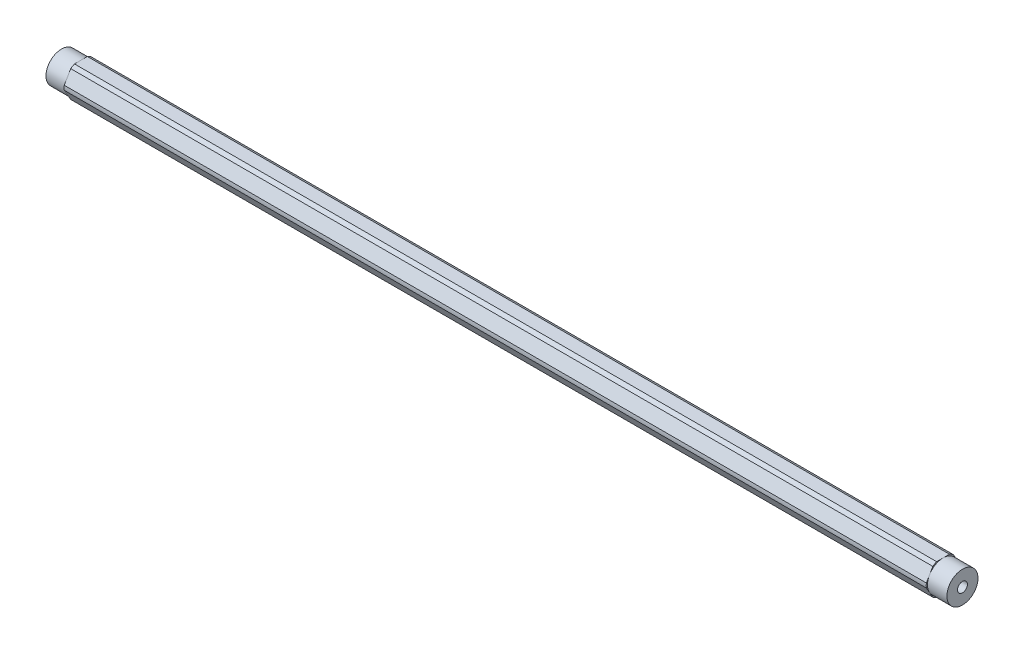
ISO-10303-21;
HEADER;
FILE_DESCRIPTION(('STEP AP214'),'2;1');
FILE_NAME('part.step','',(''),(''),'','','');
FILE_SCHEMA(('AUTOMOTIVE_DESIGN { 1 0 10303 214 1 1 1 1 }'));
ENDSEC;
DATA;
#1=APPLICATION_CONTEXT('core data for automotive mechanical design processes');
#2=APPLICATION_PROTOCOL_DEFINITION('international standard','automotive_design',2000,#1);
#3=PRODUCT_CONTEXT('',#1,'mechanical');
#4=PRODUCT('Part','Part','',(#3));
#5=PRODUCT_RELATED_PRODUCT_CATEGORY('part','',(#4));
#6=PRODUCT_DEFINITION_FORMATION('','',#4);
#7=PRODUCT_DEFINITION_CONTEXT('part definition',#1,'design');
#8=PRODUCT_DEFINITION('design','',#6,#7);
#9=PRODUCT_DEFINITION_SHAPE('','',#8);
#10=(LENGTH_UNIT() NAMED_UNIT(*) SI_UNIT(.MILLI.,.METRE.));
#11=(NAMED_UNIT(*) PLANE_ANGLE_UNIT() SI_UNIT($,.RADIAN.));
#12=(NAMED_UNIT(*) SI_UNIT($,.STERADIAN.) SOLID_ANGLE_UNIT());
#13=UNCERTAINTY_MEASURE_WITH_UNIT(LENGTH_MEASURE(1.E-05),#10,'distance_accuracy_value','');
#14=(GEOMETRIC_REPRESENTATION_CONTEXT(3) GLOBAL_UNCERTAINTY_ASSIGNED_CONTEXT((#13)) GLOBAL_UNIT_ASSIGNED_CONTEXT((#10,
#11,#12)) REPRESENTATION_CONTEXT('',''));
#15=CARTESIAN_POINT('',(0.,0.,0.));
#16=DIRECTION('',(0.,0.,1.));
#17=DIRECTION('',(1.,0.,0.));
#18=AXIS2_PLACEMENT_3D('',#15,#16,#17);
#19=CARTESIAN_POINT('',(-184.15,0.,0.));
#20=DIRECTION('',(1.,0.,0.));
#21=DIRECTION('',(0.,0.,-1.));
#22=AXIS2_PLACEMENT_3D('',#19,#20,#21);
#23=PLANE('',#22);
#24=CARTESIAN_POINT('',(-184.15,0.,0.));
#25=DIRECTION('',(1.,0.,0.));
#26=DIRECTION('',(0.,0.,-1.));
#27=AXIS2_PLACEMENT_3D('',#24,#25,#26);
#28=CIRCLE('',#27,2.0193);
#29=CARTESIAN_POINT('',(-184.15,0.,-2.0193));
#30=VERTEX_POINT('',#29);
#31=EDGE_CURVE('E253',#30,#30,#28,.T.);
#32=ORIENTED_EDGE('',*,*,#31,.T.);
#33=EDGE_LOOP('',(#32));
#34=FACE_BOUND('',#33,.T.);
#35=CARTESIAN_POINT('',(-184.15,0.,0.));
#36=DIRECTION('',(1.,0.,0.));
#37=DIRECTION('',(0.,0.,-1.));
#38=AXIS2_PLACEMENT_3D('',#35,#36,#37);
#39=CIRCLE('',#38,6.35);
#40=CARTESIAN_POINT('',(-184.15,0.,-6.35));
#41=VERTEX_POINT('',#40);
#42=EDGE_CURVE('E63',#41,#41,#39,.F.);
#43=ORIENTED_EDGE('',*,*,#42,.T.);
#44=EDGE_LOOP('',(#43));
#45=FACE_BOUND('',#44,.T.);
#46=ADVANCED_FACE('F55',(#34,#45),#23,.F.);
#47=CARTESIAN_POINT('',(184.15,3.175,-5.49926131403119));
#48=DIRECTION('',(0.,-0.5,0.866025403784439));
#49=DIRECTION('',(0.,-0.866025403784439,-0.5));
#50=AXIS2_PLACEMENT_3D('',#47,#48,#49);
#51=PLANE('',#50);
#52=DIRECTION('',(-1.,0.,0.));
#53=VECTOR('',#52,1.);
#54=CARTESIAN_POINT('',(184.15,0.893039571032186,-6.81675178197583));
#55=LINE('',#54,#53);
#56=CARTESIAN_POINT('',(176.2125,0.893039571032186,-6.81675178197583));
#57=VERTEX_POINT('',#56);
#58=CARTESIAN_POINT('',(-176.2125,0.893039571032186,-6.81675178197583));
#59=VERTEX_POINT('',#58);
#60=EDGE_CURVE('E212',#57,#59,#55,.T.);
#61=ORIENTED_EDGE('',*,*,#60,.T.);
#62=DIRECTION('',(0.,0.866025403784439,0.5));
#63=VECTOR('',#62,1.);
#64=CARTESIAN_POINT('',(-176.2125,3.175,-5.49926131403119));
#65=LINE('',#64,#63);
#66=CARTESIAN_POINT('',(-176.2125,3.175,-5.49926131403118));
#67=VERTEX_POINT('',#66);
#68=EDGE_CURVE('E70',#59,#67,#65,.T.);
#69=ORIENTED_EDGE('',*,*,#68,.T.);
#70=CARTESIAN_POINT('',(-176.2125,5.45696042896782,-4.18177084608654));
#71=VERTEX_POINT('',#70);
#72=EDGE_CURVE('E181',#67,#71,#65,.T.);
#73=ORIENTED_EDGE('',*,*,#72,.T.);
#74=DIRECTION('',(-1.,0.,0.));
#75=VECTOR('',#74,1.);
#76=CARTESIAN_POINT('',(184.15,5.45696042896782,-4.18177084608655));
#77=LINE('',#76,#75);
#78=CARTESIAN_POINT('',(176.2125,5.45696042896782,-4.18177084608654));
#79=VERTEX_POINT('',#78);
#80=EDGE_CURVE('E287',#79,#71,#77,.T.);
#81=ORIENTED_EDGE('',*,*,#80,.F.);
#82=DIRECTION('',(0.,0.866025403784439,0.5));
#83=VECTOR('',#82,1.);
#84=CARTESIAN_POINT('',(176.2125,3.175,-5.49926131403119));
#85=LINE('',#84,#83);
#86=CARTESIAN_POINT('',(176.2125,3.175,-5.49926131403118));
#87=VERTEX_POINT('',#86);
#88=EDGE_CURVE('E247',#87,#79,#85,.T.);
#89=ORIENTED_EDGE('',*,*,#88,.F.);
#90=EDGE_CURVE('E249',#57,#87,#85,.T.);
#91=ORIENTED_EDGE('',*,*,#90,.F.);
#92=EDGE_LOOP('',(#61,#69,#73,#81,#89,#91));
#93=FACE_BOUND('',#92,.T.);
#94=ADVANCED_FACE('F209',(#93),#51,.F.);
#95=CARTESIAN_POINT('',(184.15,0.,0.));
#96=DIRECTION('',(-1.,0.,0.));
#97=DIRECTION('',(0.,0.,1.));
#98=AXIS2_PLACEMENT_3D('',#95,#96,#97);
#99=CYLINDRICAL_SURFACE('',#98,6.874999966);
#100=ORIENTED_EDGE('',*,*,#80,.T.);
#101=CARTESIAN_POINT('',(-176.2125,0.,0.));
#102=DIRECTION('',(1.,0.,0.));
#103=DIRECTION('',(0.,0.,-1.));
#104=AXIS2_PLACEMENT_3D('',#101,#102,#103);
#105=CIRCLE('',#104,6.874999966);
#106=CARTESIAN_POINT('',(-176.2125,6.35,-2.63498093588929));
#107=VERTEX_POINT('',#106);
#108=EDGE_CURVE('E187',#71,#107,#105,.T.);
#109=ORIENTED_EDGE('',*,*,#108,.T.);
#110=DIRECTION('',(-1.,0.,0.));
#111=VECTOR('',#110,1.);
#112=CARTESIAN_POINT('',(184.15,6.35,-2.63498093588929));
#113=LINE('',#112,#111);
#114=CARTESIAN_POINT('',(176.2125,6.35,-2.63498093588929));
#115=VERTEX_POINT('',#114);
#116=EDGE_CURVE('E284',#115,#107,#113,.T.);
#117=ORIENTED_EDGE('',*,*,#116,.F.);
#118=CARTESIAN_POINT('',(176.2125,0.,0.));
#119=DIRECTION('',(1.,0.,0.));
#120=DIRECTION('',(0.,0.,-1.));
#121=AXIS2_PLACEMENT_3D('',#118,#119,#120);
#122=CIRCLE('',#121,6.874999966);
#123=EDGE_CURVE('E245',#79,#115,#122,.T.);
#124=ORIENTED_EDGE('',*,*,#123,.F.);
#125=EDGE_LOOP('',(#100,#109,#117,#124));
#126=FACE_BOUND('',#125,.T.);
#127=ADVANCED_FACE('F311',(#126),#99,.T.);
#128=CARTESIAN_POINT('',(184.15,6.35,0.));
#129=DIRECTION('',(0.,-1.,0.));
#130=DIRECTION('',(0.,0.,-1.));
#131=AXIS2_PLACEMENT_3D('',#128,#129,#130);
#132=PLANE('',#131);
#133=ORIENTED_EDGE('',*,*,#116,.T.);
#134=DIRECTION('',(0.,0.,1.));
#135=VECTOR('',#134,1.);
#136=CARTESIAN_POINT('',(-176.2125,6.35,0.));
#137=LINE('',#136,#135);
#138=CARTESIAN_POINT('',(-176.2125,6.35,0.));
#139=VERTEX_POINT('',#138);
#140=EDGE_CURVE('E350',#107,#139,#137,.T.);
#141=ORIENTED_EDGE('',*,*,#140,.T.);
#142=CARTESIAN_POINT('',(-176.2125,6.35,2.63498093588929));
#143=VERTEX_POINT('',#142);
#144=EDGE_CURVE('E353',#139,#143,#137,.T.);
#145=ORIENTED_EDGE('',*,*,#144,.T.);
#146=DIRECTION('',(-1.,0.,0.));
#147=VECTOR('',#146,1.);
#148=CARTESIAN_POINT('',(184.15,6.35,2.63498093588929));
#149=LINE('',#148,#147);
#150=CARTESIAN_POINT('',(176.2125,6.35,2.63498093588929));
#151=VERTEX_POINT('',#150);
#152=EDGE_CURVE('E281',#151,#143,#149,.T.);
#153=ORIENTED_EDGE('',*,*,#152,.F.);
#154=DIRECTION('',(0.,0.,1.));
#155=VECTOR('',#154,1.);
#156=CARTESIAN_POINT('',(176.2125,6.35,0.));
#157=LINE('',#156,#155);
#158=CARTESIAN_POINT('',(176.2125,6.35,0.));
#159=VERTEX_POINT('',#158);
#160=EDGE_CURVE('E242',#159,#151,#157,.T.);
#161=ORIENTED_EDGE('',*,*,#160,.F.);
#162=EDGE_CURVE('E244',#115,#159,#157,.T.);
#163=ORIENTED_EDGE('',*,*,#162,.F.);
#164=EDGE_LOOP('',(#133,#141,#145,#153,#161,#163));
#165=FACE_BOUND('',#164,.T.);
#166=ADVANCED_FACE('F318',(#165),#132,.F.);
#167=ORIENTED_EDGE('',*,*,#152,.T.);
#168=CARTESIAN_POINT('',(-176.2125,0.,0.));
#169=DIRECTION('',(1.,0.,0.));
#170=DIRECTION('',(0.,0.,-1.));
#171=AXIS2_PLACEMENT_3D('',#168,#169,#170);
#172=CIRCLE('',#171,6.874999966);
#173=CARTESIAN_POINT('',(-176.2125,5.45696042896782,4.18177084608654));
#174=VERTEX_POINT('',#173);
#175=EDGE_CURVE('E354',#143,#174,#172,.T.);
#176=ORIENTED_EDGE('',*,*,#175,.T.);
#177=DIRECTION('',(-1.,0.,0.));
#178=VECTOR('',#177,1.);
#179=CARTESIAN_POINT('',(184.15,5.45696042896782,4.18177084608654));
#180=LINE('',#179,#178);
#181=CARTESIAN_POINT('',(176.2125,5.45696042896782,4.18177084608654));
#182=VERTEX_POINT('',#181);
#183=EDGE_CURVE('E278',#182,#174,#180,.T.);
#184=ORIENTED_EDGE('',*,*,#183,.F.);
#185=CARTESIAN_POINT('',(176.2125,0.,0.));
#186=DIRECTION('',(1.,0.,0.));
#187=DIRECTION('',(0.,0.,-1.));
#188=AXIS2_PLACEMENT_3D('',#185,#186,#187);
#189=CIRCLE('',#188,6.874999966);
#190=EDGE_CURVE('E240',#151,#182,#189,.T.);
#191=ORIENTED_EDGE('',*,*,#190,.F.);
#192=EDGE_LOOP('',(#167,#176,#184,#191));
#193=FACE_BOUND('',#192,.T.);
#194=ADVANCED_FACE('F320',(#193),#99,.T.);
#195=CARTESIAN_POINT('',(184.15,3.175,5.49926131403119));
#196=DIRECTION('',(0.,-0.5,-0.866025403784439));
#197=DIRECTION('',(0.,0.866025403784439,-0.5));
#198=AXIS2_PLACEMENT_3D('',#195,#196,#197);
#199=PLANE('',#198);
#200=ORIENTED_EDGE('',*,*,#183,.T.);
#201=DIRECTION('',(0.,-0.866025403784439,0.5));
#202=VECTOR('',#201,1.);
#203=CARTESIAN_POINT('',(-176.2125,3.175,5.49926131403119));
#204=LINE('',#203,#202);
#205=CARTESIAN_POINT('',(-176.2125,3.175,5.49926131403119));
#206=VERTEX_POINT('',#205);
#207=EDGE_CURVE('E358',#174,#206,#204,.T.);
#208=ORIENTED_EDGE('',*,*,#207,.T.);
#209=CARTESIAN_POINT('',(-176.2125,0.893039571032176,6.81675178197583));
#210=VERTEX_POINT('',#209);
#211=EDGE_CURVE('E359',#206,#210,#204,.T.);
#212=ORIENTED_EDGE('',*,*,#211,.T.);
#213=DIRECTION('',(-1.,0.,0.));
#214=VECTOR('',#213,1.);
#215=CARTESIAN_POINT('',(184.15,0.893039571032176,6.81675178197583));
#216=LINE('',#215,#214);
#217=CARTESIAN_POINT('',(176.2125,0.893039571032176,6.81675178197583));
#218=VERTEX_POINT('',#217);
#219=EDGE_CURVE('E275',#218,#210,#216,.T.);
#220=ORIENTED_EDGE('',*,*,#219,.F.);
#221=DIRECTION('',(0.,-0.866025403784439,0.5));
#222=VECTOR('',#221,1.);
#223=CARTESIAN_POINT('',(176.2125,3.175,5.49926131403119));
#224=LINE('',#223,#222);
#225=CARTESIAN_POINT('',(176.2125,3.175,5.49926131403119));
#226=VERTEX_POINT('',#225);
#227=EDGE_CURVE('E237',#226,#218,#224,.T.);
#228=ORIENTED_EDGE('',*,*,#227,.F.);
#229=EDGE_CURVE('E239',#182,#226,#224,.T.);
#230=ORIENTED_EDGE('',*,*,#229,.F.);
#231=EDGE_LOOP('',(#200,#208,#212,#220,#228,#230));
#232=FACE_BOUND('',#231,.T.);
#233=ADVANCED_FACE('F337',(#232),#199,.F.);
#234=ORIENTED_EDGE('',*,*,#219,.T.);
#235=CARTESIAN_POINT('',(-176.2125,0.,0.));
#236=DIRECTION('',(1.,0.,0.));
#237=DIRECTION('',(0.,0.,-1.));
#238=AXIS2_PLACEMENT_3D('',#235,#236,#237);
#239=CIRCLE('',#238,6.874999966);
#240=CARTESIAN_POINT('',(-176.2125,-0.893039571032174,6.81675178197583));
#241=VERTEX_POINT('',#240);
#242=EDGE_CURVE('E362',#210,#241,#239,.T.);
#243=ORIENTED_EDGE('',*,*,#242,.T.);
#244=DIRECTION('',(-1.,0.,0.));
#245=VECTOR('',#244,1.);
#246=CARTESIAN_POINT('',(184.15,-0.893039571032174,6.81675178197583));
#247=LINE('',#246,#245);
#248=CARTESIAN_POINT('',(176.2125,-0.893039571032174,6.81675178197583));
#249=VERTEX_POINT('',#248);
#250=EDGE_CURVE('E272',#249,#241,#247,.T.);
#251=ORIENTED_EDGE('',*,*,#250,.F.);
#252=CARTESIAN_POINT('',(176.2125,0.,0.));
#253=DIRECTION('',(1.,0.,0.));
#254=DIRECTION('',(0.,0.,-1.));
#255=AXIS2_PLACEMENT_3D('',#252,#253,#254);
#256=CIRCLE('',#255,6.874999966);
#257=EDGE_CURVE('E235',#218,#249,#256,.T.);
#258=ORIENTED_EDGE('',*,*,#257,.F.);
#259=EDGE_LOOP('',(#234,#243,#251,#258));
#260=FACE_BOUND('',#259,.T.);
#261=ADVANCED_FACE('F335',(#260),#99,.T.);
#262=CARTESIAN_POINT('',(184.15,-3.175,5.49926131403118));
#263=DIRECTION('',(0.,0.5,-0.866025403784438));
#264=DIRECTION('',(0.,0.866025403784439,0.5));
#265=AXIS2_PLACEMENT_3D('',#262,#263,#264);
#266=PLANE('',#265);
#267=ORIENTED_EDGE('',*,*,#250,.T.);
#268=DIRECTION('',(0.,-0.866025403784439,-0.5));
#269=VECTOR('',#268,1.);
#270=CARTESIAN_POINT('',(-176.2125,-3.175,5.49926131403118));
#271=LINE('',#270,#269);
#272=CARTESIAN_POINT('',(-176.2125,-3.175,5.49926131403118));
#273=VERTEX_POINT('',#272);
#274=EDGE_CURVE('E365',#241,#273,#271,.T.);
#275=ORIENTED_EDGE('',*,*,#274,.T.);
#276=CARTESIAN_POINT('',(-176.2125,-5.45696042896783,4.18177084608653));
#277=VERTEX_POINT('',#276);
#278=EDGE_CURVE('E366',#273,#277,#271,.T.);
#279=ORIENTED_EDGE('',*,*,#278,.T.);
#280=DIRECTION('',(-1.,0.,0.));
#281=VECTOR('',#280,1.);
#282=CARTESIAN_POINT('',(184.15,-5.45696042896783,4.18177084608653));
#283=LINE('',#282,#281);
#284=CARTESIAN_POINT('',(176.2125,-5.45696042896783,4.18177084608653));
#285=VERTEX_POINT('',#284);
#286=EDGE_CURVE('E269',#285,#277,#283,.T.);
#287=ORIENTED_EDGE('',*,*,#286,.F.);
#288=DIRECTION('',(0.,-0.866025403784439,-0.5));
#289=VECTOR('',#288,1.);
#290=CARTESIAN_POINT('',(176.2125,-3.175,5.49926131403118));
#291=LINE('',#290,#289);
#292=CARTESIAN_POINT('',(176.2125,-3.175,5.49926131403118));
#293=VERTEX_POINT('',#292);
#294=EDGE_CURVE('E232',#293,#285,#291,.T.);
#295=ORIENTED_EDGE('',*,*,#294,.F.);
#296=EDGE_CURVE('E234',#249,#293,#291,.T.);
#297=ORIENTED_EDGE('',*,*,#296,.F.);
#298=EDGE_LOOP('',(#267,#275,#279,#287,#295,#297));
#299=FACE_BOUND('',#298,.T.);
#300=ADVANCED_FACE('F332',(#299),#266,.F.);
#301=ORIENTED_EDGE('',*,*,#286,.T.);
#302=CARTESIAN_POINT('',(-176.2125,0.,0.));
#303=DIRECTION('',(1.,0.,0.));
#304=DIRECTION('',(0.,0.,-1.));
#305=AXIS2_PLACEMENT_3D('',#302,#303,#304);
#306=CIRCLE('',#305,6.874999966);
#307=CARTESIAN_POINT('',(-176.2125,-6.35,2.63498093588929));
#308=VERTEX_POINT('',#307);
#309=EDGE_CURVE('E369',#277,#308,#306,.T.);
#310=ORIENTED_EDGE('',*,*,#309,.T.);
#311=DIRECTION('',(-1.,0.,0.));
#312=VECTOR('',#311,1.);
#313=CARTESIAN_POINT('',(184.15,-6.35,2.63498093588929));
#314=LINE('',#313,#312);
#315=CARTESIAN_POINT('',(176.2125,-6.35,2.63498093588929));
#316=VERTEX_POINT('',#315);
#317=EDGE_CURVE('E266',#316,#308,#314,.T.);
#318=ORIENTED_EDGE('',*,*,#317,.F.);
#319=CARTESIAN_POINT('',(176.2125,0.,0.));
#320=DIRECTION('',(1.,0.,0.));
#321=DIRECTION('',(0.,0.,-1.));
#322=AXIS2_PLACEMENT_3D('',#319,#320,#321);
#323=CIRCLE('',#322,6.874999966);
#324=EDGE_CURVE('E230',#285,#316,#323,.T.);
#325=ORIENTED_EDGE('',*,*,#324,.F.);
#326=EDGE_LOOP('',(#301,#310,#318,#325));
#327=FACE_BOUND('',#326,.T.);
#328=ADVANCED_FACE('F330',(#327),#99,.T.);
#329=CARTESIAN_POINT('',(184.15,-6.35,0.));
#330=DIRECTION('',(0.,1.,0.));
#331=DIRECTION('',(0.,0.,1.));
#332=AXIS2_PLACEMENT_3D('',#329,#330,#331);
#333=PLANE('',#332);
#334=ORIENTED_EDGE('',*,*,#317,.T.);
#335=DIRECTION('',(0.,0.,-1.));
#336=VECTOR('',#335,1.);
#337=CARTESIAN_POINT('',(-176.2125,-6.35,0.));
#338=LINE('',#337,#336);
#339=CARTESIAN_POINT('',(-176.2125,-6.35,0.));
#340=VERTEX_POINT('',#339);
#341=EDGE_CURVE('E372',#308,#340,#338,.T.);
#342=ORIENTED_EDGE('',*,*,#341,.T.);
#343=CARTESIAN_POINT('',(-176.2125,-6.35,-2.63498093588929));
#344=VERTEX_POINT('',#343);
#345=EDGE_CURVE('E373',#340,#344,#338,.T.);
#346=ORIENTED_EDGE('',*,*,#345,.T.);
#347=DIRECTION('',(-1.,0.,0.));
#348=VECTOR('',#347,1.);
#349=CARTESIAN_POINT('',(184.15,-6.35,-2.63498093588929));
#350=LINE('',#349,#348);
#351=CARTESIAN_POINT('',(176.2125,-6.35,-2.63498093588929));
#352=VERTEX_POINT('',#351);
#353=EDGE_CURVE('E263',#352,#344,#350,.T.);
#354=ORIENTED_EDGE('',*,*,#353,.F.);
#355=DIRECTION('',(0.,0.,-1.));
#356=VECTOR('',#355,1.);
#357=CARTESIAN_POINT('',(176.2125,-6.35,0.));
#358=LINE('',#357,#356);
#359=CARTESIAN_POINT('',(176.2125,-6.35,0.));
#360=VERTEX_POINT('',#359);
#361=EDGE_CURVE('E227',#360,#352,#358,.T.);
#362=ORIENTED_EDGE('',*,*,#361,.F.);
#363=EDGE_CURVE('E229',#316,#360,#358,.T.);
#364=ORIENTED_EDGE('',*,*,#363,.F.);
#365=EDGE_LOOP('',(#334,#342,#346,#354,#362,#364));
#366=FACE_BOUND('',#365,.T.);
#367=ADVANCED_FACE('F327',(#366),#333,.F.);
#368=ORIENTED_EDGE('',*,*,#353,.T.);
#369=CARTESIAN_POINT('',(-176.2125,0.,0.));
#370=DIRECTION('',(1.,0.,0.));
#371=DIRECTION('',(0.,0.,-1.));
#372=AXIS2_PLACEMENT_3D('',#369,#370,#371);
#373=CIRCLE('',#372,6.874999966);
#374=CARTESIAN_POINT('',(-176.2125,-5.45696042896782,-4.18177084608654));
#375=VERTEX_POINT('',#374);
#376=EDGE_CURVE('E376',#344,#375,#373,.T.);
#377=ORIENTED_EDGE('',*,*,#376,.T.);
#378=DIRECTION('',(-1.,0.,0.));
#379=VECTOR('',#378,1.);
#380=CARTESIAN_POINT('',(184.15,-5.45696042896782,-4.18177084608654));
#381=LINE('',#380,#379);
#382=CARTESIAN_POINT('',(176.2125,-5.45696042896782,-4.18177084608654));
#383=VERTEX_POINT('',#382);
#384=EDGE_CURVE('E260',#383,#375,#381,.T.);
#385=ORIENTED_EDGE('',*,*,#384,.F.);
#386=CARTESIAN_POINT('',(176.2125,0.,0.));
#387=DIRECTION('',(1.,0.,0.));
#388=DIRECTION('',(0.,0.,-1.));
#389=AXIS2_PLACEMENT_3D('',#386,#387,#388);
#390=CIRCLE('',#389,6.874999966);
#391=EDGE_CURVE('E225',#352,#383,#390,.T.);
#392=ORIENTED_EDGE('',*,*,#391,.F.);
#393=EDGE_LOOP('',(#368,#377,#385,#392));
#394=FACE_BOUND('',#393,.T.);
#395=ADVANCED_FACE('F325',(#394),#99,.T.);
#396=CARTESIAN_POINT('',(184.15,-3.175,-5.49926131403119));
#397=DIRECTION('',(0.,0.5,0.866025403784439));
#398=DIRECTION('',(0.,-0.866025403784439,0.5));
#399=AXIS2_PLACEMENT_3D('',#396,#397,#398);
#400=PLANE('',#399);
#401=ORIENTED_EDGE('',*,*,#384,.T.);
#402=DIRECTION('',(0.,0.866025403784439,-0.5));
#403=VECTOR('',#402,1.);
#404=CARTESIAN_POINT('',(-176.2125,-3.175,-5.49926131403119));
#405=LINE('',#404,#403);
#406=CARTESIAN_POINT('',(-176.2125,-3.175,-5.49926131403119));
#407=VERTEX_POINT('',#406);
#408=EDGE_CURVE('E379',#375,#407,#405,.T.);
#409=ORIENTED_EDGE('',*,*,#408,.T.);
#410=CARTESIAN_POINT('',(-176.2125,-0.893039571032182,-6.81675178197583));
#411=VERTEX_POINT('',#410);
#412=EDGE_CURVE('E196',#407,#411,#405,.T.);
#413=ORIENTED_EDGE('',*,*,#412,.T.);
#414=DIRECTION('',(-1.,0.,0.));
#415=VECTOR('',#414,1.);
#416=CARTESIAN_POINT('',(184.15,-0.893039571032182,-6.81675178197583));
#417=LINE('',#416,#415);
#418=CARTESIAN_POINT('',(176.2125,-0.893039571032182,-6.81675178197583));
#419=VERTEX_POINT('',#418);
#420=EDGE_CURVE('E257',#419,#411,#417,.T.);
#421=ORIENTED_EDGE('',*,*,#420,.F.);
#422=DIRECTION('',(0.,0.866025403784439,-0.5));
#423=VECTOR('',#422,1.);
#424=CARTESIAN_POINT('',(176.2125,-3.175,-5.49926131403119));
#425=LINE('',#424,#423);
#426=CARTESIAN_POINT('',(176.2125,-3.175,-5.49926131403119));
#427=VERTEX_POINT('',#426);
#428=EDGE_CURVE('E77',#427,#419,#425,.T.);
#429=ORIENTED_EDGE('',*,*,#428,.F.);
#430=EDGE_CURVE('E224',#383,#427,#425,.T.);
#431=ORIENTED_EDGE('',*,*,#430,.F.);
#432=EDGE_LOOP('',(#401,#409,#413,#421,#429,#431));
#433=FACE_BOUND('',#432,.T.);
#434=ADVANCED_FACE('F322',(#433),#400,.F.);
#435=ORIENTED_EDGE('',*,*,#420,.T.);
#436=CARTESIAN_POINT('',(-176.2125,0.,0.));
#437=DIRECTION('',(1.,0.,0.));
#438=DIRECTION('',(0.,0.,-1.));
#439=AXIS2_PLACEMENT_3D('',#436,#437,#438);
#440=CIRCLE('',#439,6.874999966);
#441=EDGE_CURVE('E12',#411,#59,#440,.T.);
#442=ORIENTED_EDGE('',*,*,#441,.T.);
#443=ORIENTED_EDGE('',*,*,#60,.F.);
#444=CARTESIAN_POINT('',(176.2125,0.,0.));
#445=DIRECTION('',(1.,0.,0.));
#446=DIRECTION('',(0.,0.,-1.));
#447=AXIS2_PLACEMENT_3D('',#444,#445,#446);
#448=CIRCLE('',#447,6.874999966);
#449=EDGE_CURVE('E292',#419,#57,#448,.T.);
#450=ORIENTED_EDGE('',*,*,#449,.F.);
#451=EDGE_LOOP('',(#435,#442,#443,#450));
#452=FACE_BOUND('',#451,.T.);
#453=ADVANCED_FACE('F321',(#452),#99,.T.);
#454=CARTESIAN_POINT('',(184.15,0.,0.));
#455=DIRECTION('',(1.,0.,0.));
#456=DIRECTION('',(0.,0.,-1.));
#457=AXIS2_PLACEMENT_3D('',#454,#455,#456);
#458=PLANE('',#457);
#459=CARTESIAN_POINT('',(184.15,0.,0.));
#460=DIRECTION('',(1.,0.,0.));
#461=DIRECTION('',(0.,0.,-1.));
#462=AXIS2_PLACEMENT_3D('',#459,#460,#461);
#463=CIRCLE('',#462,2.0193);
#464=CARTESIAN_POINT('',(184.15,0.,-2.0193));
#465=VERTEX_POINT('',#464);
#466=EDGE_CURVE('E250',#465,#465,#463,.T.);
#467=ORIENTED_EDGE('',*,*,#466,.F.);
#468=EDGE_LOOP('',(#467));
#469=FACE_BOUND('',#468,.T.);
#470=CARTESIAN_POINT('',(184.15,0.,0.));
#471=DIRECTION('',(1.,0.,0.));
#472=DIRECTION('',(0.,0.,-1.));
#473=AXIS2_PLACEMENT_3D('',#470,#471,#472);
#474=CIRCLE('',#473,6.35);
#475=CARTESIAN_POINT('',(184.15,0.,-6.35));
#476=VERTEX_POINT('',#475);
#477=EDGE_CURVE('E289',#476,#476,#474,.T.);
#478=ORIENTED_EDGE('',*,*,#477,.T.);
#479=EDGE_LOOP('',(#478));
#480=FACE_BOUND('',#479,.T.);
#481=ADVANCED_FACE('F314',(#469,#480),#458,.T.);
#482=CARTESIAN_POINT('',(184.15,0.,0.));
#483=DIRECTION('',(-1.,0.,0.));
#484=DIRECTION('',(0.,0.,1.));
#485=AXIS2_PLACEMENT_3D('',#482,#483,#484);
#486=CYLINDRICAL_SURFACE('',#485,2.0193);
#487=ORIENTED_EDGE('',*,*,#466,.T.);
#488=EDGE_LOOP('',(#487));
#489=FACE_BOUND('',#488,.T.);
#490=ORIENTED_EDGE('',*,*,#31,.F.);
#491=EDGE_LOOP('',(#490));
#492=FACE_BOUND('',#491,.T.);
#493=ADVANCED_FACE('F57',(#489,#492),#486,.F.);
#494=CARTESIAN_POINT('',(176.2125,0.,0.));
#495=DIRECTION('',(1.,0.,0.));
#496=DIRECTION('',(0.,0.,-1.));
#497=AXIS2_PLACEMENT_3D('',#494,#495,#496);
#498=PLANE('',#497);
#499=ORIENTED_EDGE('',*,*,#90,.T.);
#500=CARTESIAN_POINT('',(176.2125,0.,0.));
#501=DIRECTION('',(1.,0.,0.));
#502=DIRECTION('',(0.,0.,-1.));
#503=AXIS2_PLACEMENT_3D('',#500,#501,#502);
#504=CIRCLE('',#503,6.35);
#505=EDGE_CURVE('E213',#427,#87,#504,.T.);
#506=ORIENTED_EDGE('',*,*,#505,.F.);
#507=ORIENTED_EDGE('',*,*,#428,.T.);
#508=ORIENTED_EDGE('',*,*,#449,.T.);
#509=EDGE_LOOP('',(#499,#506,#507,#508));
#510=FACE_BOUND('',#509,.T.);
#511=ADVANCED_FACE('F426',(#510),#498,.T.);
#512=ORIENTED_EDGE('',*,*,#88,.T.);
#513=ORIENTED_EDGE('',*,*,#123,.T.);
#514=ORIENTED_EDGE('',*,*,#162,.T.);
#515=EDGE_CURVE('E217',#87,#159,#504,.T.);
#516=ORIENTED_EDGE('',*,*,#515,.F.);
#517=EDGE_LOOP('',(#512,#513,#514,#516));
#518=FACE_BOUND('',#517,.T.);
#519=ADVANCED_FACE('F420',(#518),#498,.T.);
#520=ORIENTED_EDGE('',*,*,#160,.T.);
#521=ORIENTED_EDGE('',*,*,#190,.T.);
#522=ORIENTED_EDGE('',*,*,#229,.T.);
#523=EDGE_CURVE('E222',#159,#226,#504,.T.);
#524=ORIENTED_EDGE('',*,*,#523,.F.);
#525=EDGE_LOOP('',(#520,#521,#522,#524));
#526=FACE_BOUND('',#525,.T.);
#527=ADVANCED_FACE('F409',(#526),#498,.T.);
#528=ORIENTED_EDGE('',*,*,#227,.T.);
#529=ORIENTED_EDGE('',*,*,#257,.T.);
#530=ORIENTED_EDGE('',*,*,#296,.T.);
#531=EDGE_CURVE('E414',#226,#293,#504,.T.);
#532=ORIENTED_EDGE('',*,*,#531,.F.);
#533=EDGE_LOOP('',(#528,#529,#530,#532));
#534=FACE_BOUND('',#533,.T.);
#535=ADVANCED_FACE('F442',(#534),#498,.T.);
#536=ORIENTED_EDGE('',*,*,#294,.T.);
#537=ORIENTED_EDGE('',*,*,#324,.T.);
#538=ORIENTED_EDGE('',*,*,#363,.T.);
#539=EDGE_CURVE('E428',#293,#360,#504,.T.);
#540=ORIENTED_EDGE('',*,*,#539,.F.);
#541=EDGE_LOOP('',(#536,#537,#538,#540));
#542=FACE_BOUND('',#541,.T.);
#543=ADVANCED_FACE('F436',(#542),#498,.T.);
#544=ORIENTED_EDGE('',*,*,#361,.T.);
#545=ORIENTED_EDGE('',*,*,#391,.T.);
#546=ORIENTED_EDGE('',*,*,#430,.T.);
#547=EDGE_CURVE('E215',#360,#427,#504,.T.);
#548=ORIENTED_EDGE('',*,*,#547,.F.);
#549=EDGE_LOOP('',(#544,#545,#546,#548));
#550=FACE_BOUND('',#549,.T.);
#551=ADVANCED_FACE('F424',(#550),#498,.T.);
#552=CARTESIAN_POINT('',(176.2125,0.,0.));
#553=DIRECTION('',(1.,0.,0.));
#554=DIRECTION('',(0.,0.,-1.));
#555=AXIS2_PLACEMENT_3D('',#552,#553,#554);
#556=CYLINDRICAL_SURFACE('',#555,6.35);
#557=ORIENTED_EDGE('',*,*,#477,.F.);
#558=EDGE_LOOP('',(#557));
#559=FACE_BOUND('',#558,.T.);
#560=ORIENTED_EDGE('',*,*,#505,.T.);
#561=ORIENTED_EDGE('',*,*,#515,.T.);
#562=ORIENTED_EDGE('',*,*,#523,.T.);
#563=ORIENTED_EDGE('',*,*,#531,.T.);
#564=ORIENTED_EDGE('',*,*,#539,.T.);
#565=ORIENTED_EDGE('',*,*,#547,.T.);
#566=EDGE_LOOP('',(#560,#561,#562,#563,#564,#565));
#567=FACE_BOUND('',#566,.T.);
#568=ADVANCED_FACE('F416',(#559,#567),#556,.T.);
#569=CARTESIAN_POINT('',(-176.2125,0.,0.));
#570=DIRECTION('',(1.,0.,0.));
#571=DIRECTION('',(0.,0.,-1.));
#572=AXIS2_PLACEMENT_3D('',#569,#570,#571);
#573=PLANE('',#572);
#574=ORIENTED_EDGE('',*,*,#441,.F.);
#575=ORIENTED_EDGE('',*,*,#412,.F.);
#576=CARTESIAN_POINT('',(-176.2125,0.,0.));
#577=DIRECTION('',(1.,0.,0.));
#578=DIRECTION('',(0.,0.,-1.));
#579=AXIS2_PLACEMENT_3D('',#576,#577,#578);
#580=CIRCLE('',#579,6.35);
#581=EDGE_CURVE('E193',#407,#67,#580,.T.);
#582=ORIENTED_EDGE('',*,*,#581,.T.);
#583=ORIENTED_EDGE('',*,*,#68,.F.);
#584=EDGE_LOOP('',(#574,#575,#582,#583));
#585=FACE_BOUND('',#584,.T.);
#586=ADVANCED_FACE('F194',(#585),#573,.F.);
#587=EDGE_CURVE('E184',#67,#139,#580,.T.);
#588=ORIENTED_EDGE('',*,*,#587,.T.);
#589=ORIENTED_EDGE('',*,*,#140,.F.);
#590=ORIENTED_EDGE('',*,*,#108,.F.);
#591=ORIENTED_EDGE('',*,*,#72,.F.);
#592=EDGE_LOOP('',(#588,#589,#590,#591));
#593=FACE_BOUND('',#592,.T.);
#594=ADVANCED_FACE('F182',(#593),#573,.F.);
#595=EDGE_CURVE('E207',#139,#206,#580,.T.);
#596=ORIENTED_EDGE('',*,*,#595,.T.);
#597=ORIENTED_EDGE('',*,*,#207,.F.);
#598=ORIENTED_EDGE('',*,*,#175,.F.);
#599=ORIENTED_EDGE('',*,*,#144,.F.);
#600=EDGE_LOOP('',(#596,#597,#598,#599));
#601=FACE_BOUND('',#600,.T.);
#602=ADVANCED_FACE('F400',(#601),#573,.F.);
#603=EDGE_CURVE('E395',#206,#273,#580,.T.);
#604=ORIENTED_EDGE('',*,*,#603,.T.);
#605=ORIENTED_EDGE('',*,*,#274,.F.);
#606=ORIENTED_EDGE('',*,*,#242,.F.);
#607=ORIENTED_EDGE('',*,*,#211,.F.);
#608=EDGE_LOOP('',(#604,#605,#606,#607));
#609=FACE_BOUND('',#608,.T.);
#610=ADVANCED_FACE('F439',(#609),#573,.F.);
#611=EDGE_CURVE('E392',#273,#340,#580,.T.);
#612=ORIENTED_EDGE('',*,*,#611,.T.);
#613=ORIENTED_EDGE('',*,*,#341,.F.);
#614=ORIENTED_EDGE('',*,*,#309,.F.);
#615=ORIENTED_EDGE('',*,*,#278,.F.);
#616=EDGE_LOOP('',(#612,#613,#614,#615));
#617=FACE_BOUND('',#616,.T.);
#618=ADVANCED_FACE('F302',(#617),#573,.F.);
#619=EDGE_CURVE('E200',#340,#407,#580,.T.);
#620=ORIENTED_EDGE('',*,*,#619,.T.);
#621=ORIENTED_EDGE('',*,*,#408,.F.);
#622=ORIENTED_EDGE('',*,*,#376,.F.);
#623=ORIENTED_EDGE('',*,*,#345,.F.);
#624=EDGE_LOOP('',(#620,#621,#622,#623));
#625=FACE_BOUND('',#624,.T.);
#626=ADVANCED_FACE('F297',(#625),#573,.F.);
#627=CARTESIAN_POINT('',(-176.2125,0.,0.));
#628=DIRECTION('',(-1.,0.,0.));
#629=DIRECTION('',(0.,0.,1.));
#630=AXIS2_PLACEMENT_3D('',#627,#628,#629);
#631=CYLINDRICAL_SURFACE('',#630,6.35);
#632=ORIENTED_EDGE('',*,*,#587,.F.);
#633=ORIENTED_EDGE('',*,*,#581,.F.);
#634=ORIENTED_EDGE('',*,*,#619,.F.);
#635=ORIENTED_EDGE('',*,*,#611,.F.);
#636=ORIENTED_EDGE('',*,*,#603,.F.);
#637=ORIENTED_EDGE('',*,*,#595,.F.);
#638=EDGE_LOOP('',(#632,#633,#634,#635,#636,#637));
#639=FACE_BOUND('',#638,.T.);
#640=ORIENTED_EDGE('',*,*,#42,.F.);
#641=EDGE_LOOP('',(#640));
#642=FACE_BOUND('',#641,.T.);
#643=ADVANCED_FACE('F203',(#639,#642),#631,.T.);
#644=CLOSED_SHELL('',(#46,#94,#127,#166,#194,#233,#261,#300,#328,#367,#395,#434,#453,#481,#493,
#511,#519,#527,#535,#543,#551,#568,#586,#594,#602,#610,#618,#626,#643));
#645=MANIFOLD_SOLID_BREP('B2',#644);
#646=ADVANCED_BREP_SHAPE_REPRESENTATION('',(#18,#645),#14);
#647=SHAPE_DEFINITION_REPRESENTATION(#9,#646);
ENDSEC;
END-ISO-10303-21;
